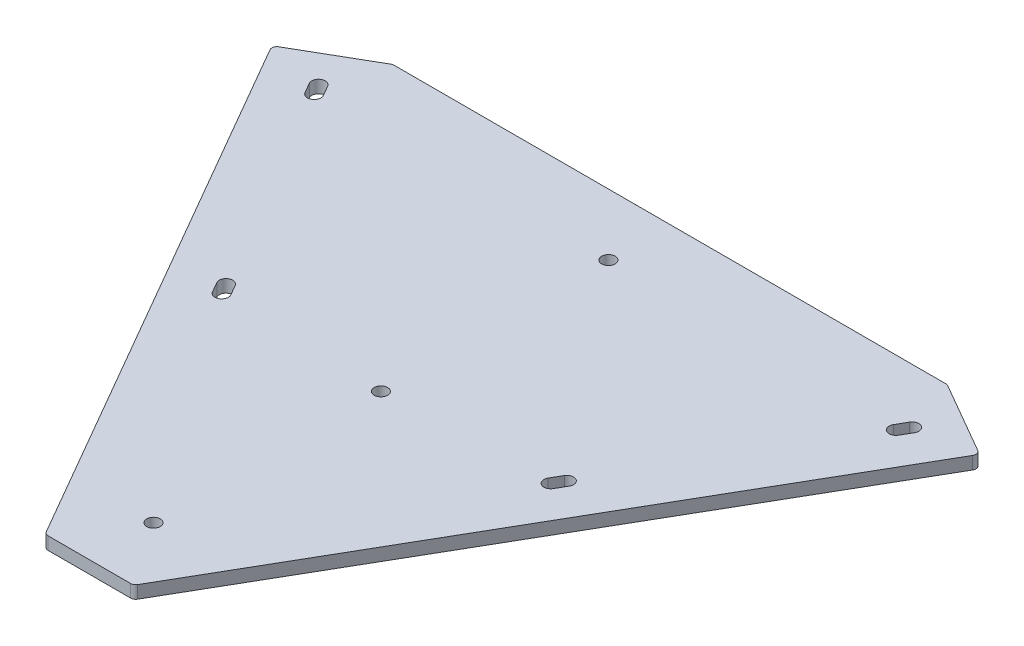
ISO-10303-21;
HEADER;
FILE_DESCRIPTION(('STEP AP214'),'2;1');
FILE_NAME('part.step','',(''),(''),'','','');
FILE_SCHEMA(('AUTOMOTIVE_DESIGN { 1 0 10303 214 1 1 1 1 }'));
ENDSEC;
DATA;
#1=APPLICATION_CONTEXT('core data for automotive mechanical design processes');
#2=APPLICATION_PROTOCOL_DEFINITION('international standard','automotive_design',2000,#1);
#3=PRODUCT_CONTEXT('',#1,'mechanical');
#4=PRODUCT('Part','Part','',(#3));
#5=PRODUCT_RELATED_PRODUCT_CATEGORY('part','',(#4));
#6=PRODUCT_DEFINITION_FORMATION('','',#4);
#7=PRODUCT_DEFINITION_CONTEXT('part definition',#1,'design');
#8=PRODUCT_DEFINITION('design','',#6,#7);
#9=PRODUCT_DEFINITION_SHAPE('','',#8);
#10=(LENGTH_UNIT() NAMED_UNIT(*) SI_UNIT(.MILLI.,.METRE.));
#11=(NAMED_UNIT(*) PLANE_ANGLE_UNIT() SI_UNIT($,.RADIAN.));
#12=(NAMED_UNIT(*) SI_UNIT($,.STERADIAN.) SOLID_ANGLE_UNIT());
#13=UNCERTAINTY_MEASURE_WITH_UNIT(LENGTH_MEASURE(1.E-05),#10,'distance_accuracy_value','');
#14=(GEOMETRIC_REPRESENTATION_CONTEXT(3) GLOBAL_UNCERTAINTY_ASSIGNED_CONTEXT((#13)) GLOBAL_UNIT_ASSIGNED_CONTEXT((#10,
#11,#12)) REPRESENTATION_CONTEXT('',''));
#15=CARTESIAN_POINT('',(0.,0.,0.));
#16=DIRECTION('',(0.,0.,1.));
#17=DIRECTION('',(1.,0.,0.));
#18=AXIS2_PLACEMENT_3D('',#15,#16,#17);
#19=CARTESIAN_POINT('',(0.,6.35,0.));
#20=DIRECTION('',(0.,-1.,0.));
#21=DIRECTION('',(0.,0.,-1.));
#22=AXIS2_PLACEMENT_3D('',#19,#20,#21);
#23=PLANE('',#22);
#24=DIRECTION('',(0.500000000000001,0.,0.866025403784438));
#25=VECTOR('',#24,1.);
#26=CARTESIAN_POINT('',(-152.042092419955,6.35,-301.038228960446));
#27=LINE('',#26,#25);
#28=CARTESIAN_POINT('',(-152.042092419955,6.35,-301.038228960446));
#29=VERTEX_POINT('',#28);
#30=CARTESIAN_POINT('',(-149.070292419956,6.35,-295.890920370512));
#31=VERTEX_POINT('',#30);
#32=EDGE_CURVE('E266',#29,#31,#27,.T.);
#33=ORIENTED_EDGE('',*,*,#32,.F.);
#34=CARTESIAN_POINT('',(-149.116485400892,6.35,-302.727328960445));
#35=DIRECTION('',(0.,1.,0.));
#36=DIRECTION('',(0.,0.,1.));
#37=AXIS2_PLACEMENT_3D('',#34,#35,#36);
#38=CIRCLE('',#37,3.37819999999928);
#39=CARTESIAN_POINT('',(-146.190878381827,6.35,-304.416428960445));
#40=VERTEX_POINT('',#39);
#41=EDGE_CURVE('E231',#40,#29,#38,.T.);
#42=ORIENTED_EDGE('',*,*,#41,.F.);
#43=DIRECTION('',(-0.499999999999997,0.,-0.86602540378444));
#44=VECTOR('',#43,1.);
#45=CARTESIAN_POINT('',(-146.190878381827,6.35,-304.416428960445));
#46=LINE('',#45,#44);
#47=CARTESIAN_POINT('',(-143.219078381827,6.35,-299.269120370512));
#48=VERTEX_POINT('',#47);
#49=EDGE_CURVE('E252',#48,#40,#46,.T.);
#50=ORIENTED_EDGE('',*,*,#49,.F.);
#51=CARTESIAN_POINT('',(-146.144685400892,6.35,-297.580020370512));
#52=DIRECTION('',(0.,1.,0.));
#53=DIRECTION('',(0.,0.,1.));
#54=AXIS2_PLACEMENT_3D('',#51,#52,#53);
#55=CIRCLE('',#54,3.37819999999927);
#56=EDGE_CURVE('E257',#31,#48,#55,.T.);
#57=ORIENTED_EDGE('',*,*,#56,.F.);
#58=EDGE_LOOP('',(#33,#42,#50,#57));
#59=FACE_BOUND('',#58,.T.);
#60=DIRECTION('',(0.499999999999999,0.,-0.866025403784439));
#61=VECTOR('',#60,1.);
#62=CARTESIAN_POINT('',(85.570292419956,6.35,-185.905694089889));
#63=LINE('',#62,#61);
#64=CARTESIAN_POINT('',(85.570292419956,6.35,-185.905694089889));
#65=VERTEX_POINT('',#64);
#66=CARTESIAN_POINT('',(88.542092419956,6.35,-191.053002679822));
#67=VERTEX_POINT('',#66);
#68=EDGE_CURVE('E303',#65,#67,#63,.T.);
#69=ORIENTED_EDGE('',*,*,#68,.F.);
#70=CARTESIAN_POINT('',(82.6446854008914,6.35,-187.594794089889));
#71=DIRECTION('',(0.,1.,0.));
#72=DIRECTION('',(0.,0.,-1.));
#73=AXIS2_PLACEMENT_3D('',#70,#71,#72);
#74=CIRCLE('',#73,3.3782);
#75=CARTESIAN_POINT('',(79.7190783818268,6.35,-189.283894089889));
#76=VERTEX_POINT('',#75);
#77=EDGE_CURVE('E300',#76,#65,#74,.T.);
#78=ORIENTED_EDGE('',*,*,#77,.F.);
#79=DIRECTION('',(-0.500000000000001,0.,0.866025403784438));
#80=VECTOR('',#79,1.);
#81=CARTESIAN_POINT('',(79.7190783818268,6.35,-189.283894089889));
#82=LINE('',#81,#80);
#83=CARTESIAN_POINT('',(82.6908783818268,6.35,-194.431202679822));
#84=VERTEX_POINT('',#83);
#85=EDGE_CURVE('E287',#84,#76,#82,.T.);
#86=ORIENTED_EDGE('',*,*,#85,.F.);
#87=CARTESIAN_POINT('',(85.6164854008914,6.35,-192.742102679822));
#88=DIRECTION('',(0.,1.,0.));
#89=DIRECTION('',(0.,0.,-1.));
#90=AXIS2_PLACEMENT_3D('',#87,#88,#89);
#91=CIRCLE('',#90,3.3782);
#92=EDGE_CURVE('E307',#67,#84,#91,.T.);
#93=ORIENTED_EDGE('',*,*,#92,.F.);
#94=EDGE_LOOP('',(#69,#78,#86,#93));
#95=FACE_BOUND('',#94,.T.);
#96=DIRECTION('',(-0.499999999999997,0.,0.86602540378444));
#97=VECTOR('',#96,1.);
#98=CARTESIAN_POINT('',(146.190878381827,6.35,-304.416428960445));
#99=LINE('',#98,#97);
#100=CARTESIAN_POINT('',(146.190878381827,6.35,-304.416428960445));
#101=VERTEX_POINT('',#100);
#102=CARTESIAN_POINT('',(143.219078381827,6.35,-299.269120370512));
#103=VERTEX_POINT('',#102);
#104=EDGE_CURVE('E391',#101,#103,#99,.T.);
#105=ORIENTED_EDGE('',*,*,#104,.F.);
#106=CARTESIAN_POINT('',(149.116485400892,6.35,-302.727328960445));
#107=DIRECTION('',(0.,1.,0.));
#108=DIRECTION('',(0.,0.,-1.));
#109=AXIS2_PLACEMENT_3D('',#106,#107,#108);
#110=CIRCLE('',#109,3.37819999999928);
#111=CARTESIAN_POINT('',(152.042092419955,6.35,-301.038228960446));
#112=VERTEX_POINT('',#111);
#113=EDGE_CURVE('E317',#112,#101,#110,.T.);
#114=ORIENTED_EDGE('',*,*,#113,.F.);
#115=DIRECTION('',(0.500000000000001,0.,-0.866025403784438));
#116=VECTOR('',#115,1.);
#117=CARTESIAN_POINT('',(152.042092419955,6.35,-301.038228960446));
#118=LINE('',#117,#116);
#119=CARTESIAN_POINT('',(149.070292419956,6.35,-295.890920370512));
#120=VERTEX_POINT('',#119);
#121=EDGE_CURVE('E376',#120,#112,#118,.T.);
#122=ORIENTED_EDGE('',*,*,#121,.F.);
#123=CARTESIAN_POINT('',(146.144685400892,6.35,-297.580020370512));
#124=DIRECTION('',(0.,1.,0.));
#125=DIRECTION('',(0.,0.,-1.));
#126=AXIS2_PLACEMENT_3D('',#123,#124,#125);
#127=CIRCLE('',#126,3.37819999999927);
#128=EDGE_CURVE('E395',#103,#120,#127,.T.);
#129=ORIENTED_EDGE('',*,*,#128,.F.);
#130=EDGE_LOOP('',(#105,#114,#122,#129));
#131=FACE_BOUND('',#130,.T.);
#132=DIRECTION('',(-0.500000000000001,0.,-0.866025403784438));
#133=VECTOR('',#132,1.);
#134=CARTESIAN_POINT('',(-79.7190783818268,6.35,-189.283894089889));
#135=LINE('',#134,#133);
#136=CARTESIAN_POINT('',(-79.7190783818268,6.35,-189.283894089889));
#137=VERTEX_POINT('',#136);
#138=CARTESIAN_POINT('',(-82.6908783818267,6.35,-194.431202679822));
#139=VERTEX_POINT('',#138);
#140=EDGE_CURVE('E348',#137,#139,#135,.T.);
#141=ORIENTED_EDGE('',*,*,#140,.F.);
#142=CARTESIAN_POINT('',(-82.6446854008914,6.35,-187.594794089889));
#143=DIRECTION('',(0.,1.,0.));
#144=DIRECTION('',(0.,0.,1.));
#145=AXIS2_PLACEMENT_3D('',#142,#143,#144);
#146=CIRCLE('',#145,3.3782);
#147=CARTESIAN_POINT('',(-85.570292419956,6.35,-185.905694089889));
#148=VERTEX_POINT('',#147);
#149=EDGE_CURVE('E345',#148,#137,#146,.T.);
#150=ORIENTED_EDGE('',*,*,#149,.F.);
#151=DIRECTION('',(0.499999999999999,0.,0.866025403784439));
#152=VECTOR('',#151,1.);
#153=CARTESIAN_POINT('',(-85.570292419956,6.35,-185.905694089889));
#154=LINE('',#153,#152);
#155=CARTESIAN_POINT('',(-88.542092419956,6.35,-191.053002679822));
#156=VERTEX_POINT('',#155);
#157=EDGE_CURVE('E332',#156,#148,#154,.T.);
#158=ORIENTED_EDGE('',*,*,#157,.F.);
#159=CARTESIAN_POINT('',(-85.6164854008913,6.35,-192.742102679822));
#160=DIRECTION('',(0.,1.,0.));
#161=DIRECTION('',(0.,0.,1.));
#162=AXIS2_PLACEMENT_3D('',#159,#160,#161);
#163=CIRCLE('',#162,3.3782);
#164=EDGE_CURVE('E353',#139,#156,#163,.T.);
#165=ORIENTED_EDGE('',*,*,#164,.F.);
#166=EDGE_LOOP('',(#141,#150,#158,#165));
#167=FACE_BOUND('',#166,.T.);
#168=CARTESIAN_POINT('',(-3.92077460572643E-13,6.35,-184.960881198218));
#169=DIRECTION('',(0.,1.,0.));
#170=DIRECTION('',(0.,0.,1.));
#171=AXIS2_PLACEMENT_3D('',#168,#169,#170);
#172=CIRCLE('',#171,3.37819999999999);
#173=CARTESIAN_POINT('',(-3.92077460572643E-13,6.35,-181.582681198218));
#174=VERTEX_POINT('',#173);
#175=EDGE_CURVE('E420',#174,#174,#172,.T.);
#176=ORIENTED_EDGE('',*,*,#175,.F.);
#177=EDGE_LOOP('',(#176));
#178=FACE_BOUND('',#177,.T.);
#179=CARTESIAN_POINT('',(-7.84154921145286E-13,6.35,-299.260881198218));
#180=DIRECTION('',(0.,1.,0.));
#181=DIRECTION('',(0.,0.,1.));
#182=AXIS2_PLACEMENT_3D('',#179,#180,#181);
#183=CIRCLE('',#182,3.37819999999999);
#184=CARTESIAN_POINT('',(-7.84154921145286E-13,6.35,-295.882681198218));
#185=VERTEX_POINT('',#184);
#186=EDGE_CURVE('E428',#185,#185,#183,.T.);
#187=ORIENTED_EDGE('',*,*,#186,.F.);
#188=EDGE_LOOP('',(#187));
#189=FACE_BOUND('',#188,.T.);
#190=DIRECTION('',(1.,0.,0.));
#191=VECTOR('',#190,1.);
#192=CARTESIAN_POINT('',(-22.225,6.35,-38.4948291982182));
#193=LINE('',#192,#191);
#194=CARTESIAN_POINT('',(-20.7585303162584,6.35,-38.4948291982182));
#195=VERTEX_POINT('',#194);
#196=CARTESIAN_POINT('',(20.7585303162583,6.35,-38.4948291982182));
#197=VERTEX_POINT('',#196);
#198=EDGE_CURVE('E456',#195,#197,#193,.T.);
#199=ORIENTED_EDGE('',*,*,#198,.T.);
#200=CARTESIAN_POINT('',(20.7585303162583,6.35,-41.0348291982182));
#201=DIRECTION('',(0.,-1.,0.));
#202=DIRECTION('',(0.,0.,-1.));
#203=AXIS2_PLACEMENT_3D('',#200,#201,#202);
#204=CIRCLE('',#203,2.54);
#205=CARTESIAN_POINT('',(22.9582348418708,6.35,-39.7648291982182));
#206=VERTEX_POINT('',#205);
#207=EDGE_CURVE('E527',#197,#206,#204,.F.);
#208=ORIENTED_EDGE('',*,*,#207,.T.);
#209=DIRECTION('',(0.500000000000002,0.,-0.866025403784438));
#210=VECTOR('',#209,1.);
#211=CARTESIAN_POINT('',(177.8,6.35,-307.958633585746));
#212=LINE('',#211,#210);
#213=CARTESIAN_POINT('',(176.53,6.35,-305.758929060134));
#214=VERTEX_POINT('',#213);
#215=EDGE_CURVE('E437',#206,#214,#212,.T.);
#216=ORIENTED_EDGE('',*,*,#215,.T.);
#217=CARTESIAN_POINT('',(174.330295474388,6.35,-307.028929060134));
#218=DIRECTION('',(0.,-1.,0.));
#219=DIRECTION('',(0.,0.,-1.));
#220=AXIS2_PLACEMENT_3D('',#217,#218,#219);
#221=CIRCLE('',#220,2.54);
#222=CARTESIAN_POINT('',(175.600295474388,6.35,-309.228633585746));
#223=VERTEX_POINT('',#222);
#224=EDGE_CURVE('E515',#214,#223,#221,.F.);
#225=ORIENTED_EDGE('',*,*,#224,.T.);
#226=DIRECTION('',(-0.866025403784438,0.,-0.500000000000001));
#227=VECTOR('',#226,1.);
#228=CARTESIAN_POINT('',(177.8,6.35,-307.958633585746));
#229=LINE('',#228,#227);
#230=CARTESIAN_POINT('',(139.894579853007,6.35,-329.843338111359));
#231=VERTEX_POINT('',#230);
#232=EDGE_CURVE('E441',#223,#231,#229,.T.);
#233=ORIENTED_EDGE('',*,*,#232,.T.);
#234=CARTESIAN_POINT('',(138.624579853007,6.35,-327.643633585746));
#235=DIRECTION('',(0.,-1.,0.));
#236=DIRECTION('',(0.,0.,-1.));
#237=AXIS2_PLACEMENT_3D('',#234,#235,#236);
#238=CIRCLE('',#237,2.54);
#239=CARTESIAN_POINT('',(138.624579853007,6.35,-330.183633585746));
#240=VERTEX_POINT('',#239);
#241=EDGE_CURVE('E518',#231,#240,#238,.F.);
#242=ORIENTED_EDGE('',*,*,#241,.T.);
#243=DIRECTION('',(-1.,0.,0.));
#244=VECTOR('',#243,1.);
#245=CARTESIAN_POINT('',(-139.305170801782,6.35,-330.183633585746));
#246=LINE('',#245,#244);
#247=CARTESIAN_POINT('',(-138.624579853007,6.35,-330.183633585746));
#248=VERTEX_POINT('',#247);
#249=EDGE_CURVE('E446',#240,#248,#246,.T.);
#250=ORIENTED_EDGE('',*,*,#249,.T.);
#251=CARTESIAN_POINT('',(-138.624579853007,6.35,-327.643633585746));
#252=DIRECTION('',(0.,-1.,0.));
#253=DIRECTION('',(0.,0.,-1.));
#254=AXIS2_PLACEMENT_3D('',#251,#252,#253);
#255=CIRCLE('',#254,2.54);
#256=CARTESIAN_POINT('',(-139.894579853007,6.35,-329.843338111359));
#257=VERTEX_POINT('',#256);
#258=EDGE_CURVE('E521',#248,#257,#255,.F.);
#259=ORIENTED_EDGE('',*,*,#258,.T.);
#260=DIRECTION('',(-0.866025403784438,0.,0.500000000000001));
#261=VECTOR('',#260,1.);
#262=CARTESIAN_POINT('',(-177.8,6.35,-307.958633585746));
#263=LINE('',#262,#261);
#264=CARTESIAN_POINT('',(-175.600295474388,6.35,-309.228633585746));
#265=VERTEX_POINT('',#264);
#266=EDGE_CURVE('E450',#257,#265,#263,.T.);
#267=ORIENTED_EDGE('',*,*,#266,.T.);
#268=CARTESIAN_POINT('',(-174.330295474388,6.35,-307.028929060134));
#269=DIRECTION('',(0.,-1.,0.));
#270=DIRECTION('',(0.,0.,-1.));
#271=AXIS2_PLACEMENT_3D('',#268,#269,#270);
#272=CIRCLE('',#271,2.54);
#273=CARTESIAN_POINT('',(-176.53,6.35,-305.758929060134));
#274=VERTEX_POINT('',#273);
#275=EDGE_CURVE('E60',#265,#274,#272,.F.);
#276=ORIENTED_EDGE('',*,*,#275,.T.);
#277=DIRECTION('',(0.500000000000002,0.,0.866025403784438));
#278=VECTOR('',#277,1.);
#279=CARTESIAN_POINT('',(-177.8,6.35,-307.958633585746));
#280=LINE('',#279,#278);
#281=CARTESIAN_POINT('',(-22.9582348418708,6.35,-39.7648291982181));
#282=VERTEX_POINT('',#281);
#283=EDGE_CURVE('E453',#274,#282,#280,.T.);
#284=ORIENTED_EDGE('',*,*,#283,.T.);
#285=CARTESIAN_POINT('',(-20.7585303162584,6.35,-41.0348291982182));
#286=DIRECTION('',(0.,-1.,0.));
#287=DIRECTION('',(0.,0.,-1.));
#288=AXIS2_PLACEMENT_3D('',#285,#286,#287);
#289=CIRCLE('',#288,2.54);
#290=EDGE_CURVE('E524',#282,#195,#289,.F.);
#291=ORIENTED_EDGE('',*,*,#290,.T.);
#292=EDGE_LOOP('',(#199,#208,#216,#225,#233,#242,#250,#259,#267,#276,#284,#291));
#293=FACE_BOUND('',#292,.T.);
#294=CARTESIAN_POINT('',(0.,6.35,-70.6608811982182));
#295=DIRECTION('',(0.,1.,0.));
#296=DIRECTION('',(0.,0.,1.));
#297=AXIS2_PLACEMENT_3D('',#294,#295,#296);
#298=CIRCLE('',#297,3.37819999999999);
#299=CARTESIAN_POINT('',(0.,6.35,-67.2826811982182));
#300=VERTEX_POINT('',#299);
#301=EDGE_CURVE('E276',#300,#300,#298,.T.);
#302=ORIENTED_EDGE('',*,*,#301,.F.);
#303=EDGE_LOOP('',(#302));
#304=FACE_BOUND('',#303,.T.);
#305=ADVANCED_FACE('F37',(#59,#95,#131,#167,#178,#189,#293,#304),#23,.F.);
#306=CARTESIAN_POINT('',(177.8,6.35,-307.958633585746));
#307=DIRECTION('',(-0.866025403784438,0.,-0.500000000000002));
#308=DIRECTION('',(-0.500000000000002,0.,0.866025403784438));
#309=AXIS2_PLACEMENT_3D('',#306,#307,#308);
#310=PLANE('',#309);
#311=ORIENTED_EDGE('',*,*,#215,.F.);
#312=DIRECTION('',(0.,-1.,0.));
#313=VECTOR('',#312,1.);
#314=CARTESIAN_POINT('',(22.9582348418708,6.35,-39.7648291982182));
#315=LINE('',#314,#313);
#316=CARTESIAN_POINT('',(22.9582348418708,0.,-39.7648291982182));
#317=VERTEX_POINT('',#316);
#318=EDGE_CURVE('E484',#206,#317,#315,.T.);
#319=ORIENTED_EDGE('',*,*,#318,.T.);
#320=DIRECTION('',(0.500000000000002,0.,-0.866025403784438));
#321=VECTOR('',#320,1.);
#322=CARTESIAN_POINT('',(177.8,0.,-307.958633585746));
#323=LINE('',#322,#321);
#324=CARTESIAN_POINT('',(176.53,0.,-305.758929060134));
#325=VERTEX_POINT('',#324);
#326=EDGE_CURVE('E436',#317,#325,#323,.T.);
#327=ORIENTED_EDGE('',*,*,#326,.T.);
#328=DIRECTION('',(0.,-1.,0.));
#329=VECTOR('',#328,1.);
#330=CARTESIAN_POINT('',(176.53,6.35,-305.758929060134));
#331=LINE('',#330,#329);
#332=EDGE_CURVE('E460',#325,#214,#331,.F.);
#333=ORIENTED_EDGE('',*,*,#332,.T.);
#334=EDGE_LOOP('',(#311,#319,#327,#333));
#335=FACE_BOUND('',#334,.T.);
#336=ADVANCED_FACE('F600',(#335),#310,.F.);
#337=CARTESIAN_POINT('',(177.8,6.35,-307.958633585746));
#338=DIRECTION('',(-0.500000000000001,0.,0.866025403784438));
#339=DIRECTION('',(0.866025403784438,0.,0.500000000000001));
#340=AXIS2_PLACEMENT_3D('',#337,#338,#339);
#341=PLANE('',#340);
#342=DIRECTION('',(-0.866025403784438,0.,-0.500000000000001));
#343=VECTOR('',#342,1.);
#344=CARTESIAN_POINT('',(177.8,0.,-307.958633585746));
#345=LINE('',#344,#343);
#346=CARTESIAN_POINT('',(175.600295474388,0.,-309.228633585746));
#347=VERTEX_POINT('',#346);
#348=CARTESIAN_POINT('',(139.894579853007,0.,-329.843338111359));
#349=VERTEX_POINT('',#348);
#350=EDGE_CURVE('E464',#347,#349,#345,.T.);
#351=ORIENTED_EDGE('',*,*,#350,.T.);
#352=DIRECTION('',(0.,-1.,0.));
#353=VECTOR('',#352,1.);
#354=CARTESIAN_POINT('',(139.894579853007,6.35,-329.843338111359));
#355=LINE('',#354,#353);
#356=EDGE_CURVE('E11',#349,#231,#355,.F.);
#357=ORIENTED_EDGE('',*,*,#356,.T.);
#358=ORIENTED_EDGE('',*,*,#232,.F.);
#359=DIRECTION('',(0.,-1.,0.));
#360=VECTOR('',#359,1.);
#361=CARTESIAN_POINT('',(175.600295474388,6.35,-309.228633585746));
#362=LINE('',#361,#360);
#363=EDGE_CURVE('E46',#223,#347,#362,.T.);
#364=ORIENTED_EDGE('',*,*,#363,.T.);
#365=EDGE_LOOP('',(#351,#357,#358,#364));
#366=FACE_BOUND('',#365,.T.);
#367=ADVANCED_FACE('F556',(#366),#341,.F.);
#368=CARTESIAN_POINT('',(-139.305170801782,6.35,-330.183633585746));
#369=DIRECTION('',(0.,0.,1.));
#370=DIRECTION('',(1.,0.,0.));
#371=AXIS2_PLACEMENT_3D('',#368,#369,#370);
#372=PLANE('',#371);
#373=DIRECTION('',(-1.,0.,0.));
#374=VECTOR('',#373,1.);
#375=CARTESIAN_POINT('',(-139.305170801782,0.,-330.183633585746));
#376=LINE('',#375,#374);
#377=CARTESIAN_POINT('',(138.624579853007,0.,-330.183633585746));
#378=VERTEX_POINT('',#377);
#379=CARTESIAN_POINT('',(-138.624579853007,0.,-330.183633585746));
#380=VERTEX_POINT('',#379);
#381=EDGE_CURVE('E468',#378,#380,#376,.T.);
#382=ORIENTED_EDGE('',*,*,#381,.T.);
#383=DIRECTION('',(0.,-1.,0.));
#384=VECTOR('',#383,1.);
#385=CARTESIAN_POINT('',(-138.624579853007,6.35,-330.183633585746));
#386=LINE('',#385,#384);
#387=EDGE_CURVE('E547',#380,#248,#386,.F.);
#388=ORIENTED_EDGE('',*,*,#387,.T.);
#389=ORIENTED_EDGE('',*,*,#249,.F.);
#390=DIRECTION('',(0.,-1.,0.));
#391=VECTOR('',#390,1.);
#392=CARTESIAN_POINT('',(138.624579853007,6.35,-330.183633585746));
#393=LINE('',#392,#391);
#394=EDGE_CURVE('E543',#240,#378,#393,.T.);
#395=ORIENTED_EDGE('',*,*,#394,.T.);
#396=EDGE_LOOP('',(#382,#388,#389,#395));
#397=FACE_BOUND('',#396,.T.);
#398=ADVANCED_FACE('F569',(#397),#372,.F.);
#399=CARTESIAN_POINT('',(-177.8,6.35,-307.958633585746));
#400=DIRECTION('',(0.500000000000001,0.,0.866025403784438));
#401=DIRECTION('',(0.866025403784438,0.,-0.500000000000001));
#402=AXIS2_PLACEMENT_3D('',#399,#400,#401);
#403=PLANE('',#402);
#404=ORIENTED_EDGE('',*,*,#266,.F.);
#405=DIRECTION('',(0.,-1.,0.));
#406=VECTOR('',#405,1.);
#407=CARTESIAN_POINT('',(-139.894579853007,6.35,-329.843338111359));
#408=LINE('',#407,#406);
#409=CARTESIAN_POINT('',(-139.894579853007,0.,-329.843338111359));
#410=VERTEX_POINT('',#409);
#411=EDGE_CURVE('E539',#257,#410,#408,.T.);
#412=ORIENTED_EDGE('',*,*,#411,.T.);
#413=DIRECTION('',(-0.866025403784438,0.,0.500000000000001));
#414=VECTOR('',#413,1.);
#415=CARTESIAN_POINT('',(-177.8,0.,-307.958633585746));
#416=LINE('',#415,#414);
#417=CARTESIAN_POINT('',(-175.600295474388,0.,-309.228633585746));
#418=VERTEX_POINT('',#417);
#419=EDGE_CURVE('E472',#410,#418,#416,.T.);
#420=ORIENTED_EDGE('',*,*,#419,.T.);
#421=DIRECTION('',(0.,-1.,0.));
#422=VECTOR('',#421,1.);
#423=CARTESIAN_POINT('',(-175.600295474388,6.35,-309.228633585746));
#424=LINE('',#423,#422);
#425=EDGE_CURVE('E536',#418,#265,#424,.F.);
#426=ORIENTED_EDGE('',*,*,#425,.T.);
#427=EDGE_LOOP('',(#404,#412,#420,#426));
#428=FACE_BOUND('',#427,.T.);
#429=ADVANCED_FACE('F579',(#428),#403,.F.);
#430=CARTESIAN_POINT('',(-177.8,6.35,-307.958633585746));
#431=DIRECTION('',(0.866025403784438,0.,-0.500000000000001));
#432=DIRECTION('',(-0.500000000000002,0.,-0.866025403784438));
#433=AXIS2_PLACEMENT_3D('',#430,#431,#432);
#434=PLANE('',#433);
#435=DIRECTION('',(0.500000000000002,0.,0.866025403784438));
#436=VECTOR('',#435,1.);
#437=CARTESIAN_POINT('',(-177.8,0.,-307.958633585746));
#438=LINE('',#437,#436);
#439=CARTESIAN_POINT('',(-176.53,0.,-305.758929060134));
#440=VERTEX_POINT('',#439);
#441=CARTESIAN_POINT('',(-22.9582348418708,0.,-39.7648291982181));
#442=VERTEX_POINT('',#441);
#443=EDGE_CURVE('E476',#440,#442,#438,.T.);
#444=ORIENTED_EDGE('',*,*,#443,.T.);
#445=DIRECTION('',(0.,-1.,0.));
#446=VECTOR('',#445,1.);
#447=CARTESIAN_POINT('',(-22.9582348418708,6.35,-39.7648291982182));
#448=LINE('',#447,#446);
#449=EDGE_CURVE('E53',#442,#282,#448,.F.);
#450=ORIENTED_EDGE('',*,*,#449,.T.);
#451=ORIENTED_EDGE('',*,*,#283,.F.);
#452=DIRECTION('',(0.,-1.,0.));
#453=VECTOR('',#452,1.);
#454=CARTESIAN_POINT('',(-176.53,6.35,-305.758929060134));
#455=LINE('',#454,#453);
#456=EDGE_CURVE('E530',#274,#440,#455,.T.);
#457=ORIENTED_EDGE('',*,*,#456,.T.);
#458=EDGE_LOOP('',(#444,#450,#451,#457));
#459=FACE_BOUND('',#458,.T.);
#460=ADVANCED_FACE('F584',(#459),#434,.F.);
#461=CARTESIAN_POINT('',(-22.225,6.35,-38.4948291982182));
#462=DIRECTION('',(0.,0.,-1.));
#463=DIRECTION('',(-1.,0.,0.));
#464=AXIS2_PLACEMENT_3D('',#461,#462,#463);
#465=PLANE('',#464);
#466=DIRECTION('',(1.,0.,0.));
#467=VECTOR('',#466,1.);
#468=CARTESIAN_POINT('',(-22.225,0.,-38.4948291982182));
#469=LINE('',#468,#467);
#470=CARTESIAN_POINT('',(-20.7585303162584,0.,-38.4948291982182));
#471=VERTEX_POINT('',#470);
#472=CARTESIAN_POINT('',(20.7585303162583,0.,-38.4948291982182));
#473=VERTEX_POINT('',#472);
#474=EDGE_CURVE('E442',#471,#473,#469,.T.);
#475=ORIENTED_EDGE('',*,*,#474,.T.);
#476=DIRECTION('',(0.,-1.,0.));
#477=VECTOR('',#476,1.);
#478=CARTESIAN_POINT('',(20.7585303162583,6.35,-38.4948291982182));
#479=LINE('',#478,#477);
#480=EDGE_CURVE('E510',#473,#197,#479,.F.);
#481=ORIENTED_EDGE('',*,*,#480,.T.);
#482=ORIENTED_EDGE('',*,*,#198,.F.);
#483=DIRECTION('',(0.,-1.,0.));
#484=VECTOR('',#483,1.);
#485=CARTESIAN_POINT('',(-20.7585303162584,6.35,-38.4948291982182));
#486=LINE('',#485,#484);
#487=EDGE_CURVE('E506',#195,#471,#486,.T.);
#488=ORIENTED_EDGE('',*,*,#487,.T.);
#489=EDGE_LOOP('',(#475,#481,#482,#488));
#490=FACE_BOUND('',#489,.T.);
#491=ADVANCED_FACE('F592',(#490),#465,.F.);
#492=CARTESIAN_POINT('',(0.,0.,0.));
#493=DIRECTION('',(0.,-1.,0.));
#494=DIRECTION('',(0.,0.,-1.));
#495=AXIS2_PLACEMENT_3D('',#492,#493,#494);
#496=PLANE('',#495);
#497=CARTESIAN_POINT('',(-149.116485400892,0.,-302.727328960445));
#498=DIRECTION('',(0.,1.,0.));
#499=DIRECTION('',(0.,0.,1.));
#500=AXIS2_PLACEMENT_3D('',#497,#498,#499);
#501=CIRCLE('',#500,3.37819999999928);
#502=CARTESIAN_POINT('',(-146.190878381827,0.,-304.416428960445));
#503=VERTEX_POINT('',#502);
#504=CARTESIAN_POINT('',(-152.042092419955,0.,-301.038228960446));
#505=VERTEX_POINT('',#504);
#506=EDGE_CURVE('E228',#503,#505,#501,.T.);
#507=ORIENTED_EDGE('',*,*,#506,.T.);
#508=DIRECTION('',(0.500000000000001,0.,0.866025403784438));
#509=VECTOR('',#508,1.);
#510=CARTESIAN_POINT('',(-152.042092419955,0.,-301.038228960446));
#511=LINE('',#510,#509);
#512=CARTESIAN_POINT('',(-149.070292419955,0.,-295.890920370512));
#513=VERTEX_POINT('',#512);
#514=EDGE_CURVE('E241',#505,#513,#511,.T.);
#515=ORIENTED_EDGE('',*,*,#514,.T.);
#516=CARTESIAN_POINT('',(-146.144685400892,0.,-297.580020370512));
#517=DIRECTION('',(0.,1.,0.));
#518=DIRECTION('',(0.,0.,1.));
#519=AXIS2_PLACEMENT_3D('',#516,#517,#518);
#520=CIRCLE('',#519,3.37819999999927);
#521=CARTESIAN_POINT('',(-143.219078381827,0.,-299.269120370512));
#522=VERTEX_POINT('',#521);
#523=EDGE_CURVE('E246',#513,#522,#520,.T.);
#524=ORIENTED_EDGE('',*,*,#523,.T.);
#525=DIRECTION('',(-0.499999999999997,0.,-0.86602540378444));
#526=VECTOR('',#525,1.);
#527=CARTESIAN_POINT('',(-146.190878381827,0.,-304.416428960445));
#528=LINE('',#527,#526);
#529=EDGE_CURVE('E237',#522,#503,#528,.T.);
#530=ORIENTED_EDGE('',*,*,#529,.T.);
#531=EDGE_LOOP('',(#507,#515,#524,#530));
#532=FACE_BOUND('',#531,.T.);
#533=CARTESIAN_POINT('',(82.6446854008914,0.,-187.594794089889));
#534=DIRECTION('',(0.,1.,0.));
#535=DIRECTION('',(0.,0.,-1.));
#536=AXIS2_PLACEMENT_3D('',#533,#534,#535);
#537=CIRCLE('',#536,3.3782);
#538=CARTESIAN_POINT('',(79.7190783818268,0.,-189.283894089889));
#539=VERTEX_POINT('',#538);
#540=CARTESIAN_POINT('',(85.570292419956,0.,-185.905694089889));
#541=VERTEX_POINT('',#540);
#542=EDGE_CURVE('E282',#539,#541,#537,.T.);
#543=ORIENTED_EDGE('',*,*,#542,.T.);
#544=DIRECTION('',(0.499999999999999,0.,-0.866025403784439));
#545=VECTOR('',#544,1.);
#546=CARTESIAN_POINT('',(85.570292419956,0.,-185.905694089889));
#547=LINE('',#546,#545);
#548=CARTESIAN_POINT('',(88.542092419956,0.,-191.053002679822));
#549=VERTEX_POINT('',#548);
#550=EDGE_CURVE('E286',#541,#549,#547,.T.);
#551=ORIENTED_EDGE('',*,*,#550,.T.);
#552=CARTESIAN_POINT('',(85.6164854008914,0.,-192.742102679822));
#553=DIRECTION('',(0.,1.,0.));
#554=DIRECTION('',(0.,0.,-1.));
#555=AXIS2_PLACEMENT_3D('',#552,#553,#554);
#556=CIRCLE('',#555,3.3782);
#557=CARTESIAN_POINT('',(82.6908783818268,0.,-194.431202679822));
#558=VERTEX_POINT('',#557);
#559=EDGE_CURVE('E291',#549,#558,#556,.T.);
#560=ORIENTED_EDGE('',*,*,#559,.T.);
#561=DIRECTION('',(-0.500000000000001,0.,0.866025403784438));
#562=VECTOR('',#561,1.);
#563=CARTESIAN_POINT('',(79.7190783818268,0.,-189.283894089889));
#564=LINE('',#563,#562);
#565=EDGE_CURVE('E295',#558,#539,#564,.T.);
#566=ORIENTED_EDGE('',*,*,#565,.T.);
#567=EDGE_LOOP('',(#543,#551,#560,#566));
#568=FACE_BOUND('',#567,.T.);
#569=CARTESIAN_POINT('',(149.116485400892,0.,-302.727328960445));
#570=DIRECTION('',(0.,1.,0.));
#571=DIRECTION('',(0.,0.,-1.));
#572=AXIS2_PLACEMENT_3D('',#569,#570,#571);
#573=CIRCLE('',#572,3.37819999999928);
#574=CARTESIAN_POINT('',(152.042092419955,0.,-301.038228960446));
#575=VERTEX_POINT('',#574);
#576=CARTESIAN_POINT('',(146.190878381827,0.,-304.416428960445));
#577=VERTEX_POINT('',#576);
#578=EDGE_CURVE('E371',#575,#577,#573,.T.);
#579=ORIENTED_EDGE('',*,*,#578,.T.);
#580=DIRECTION('',(-0.499999999999997,0.,0.86602540378444));
#581=VECTOR('',#580,1.);
#582=CARTESIAN_POINT('',(146.190878381827,0.,-304.416428960445));
#583=LINE('',#582,#581);
#584=CARTESIAN_POINT('',(143.219078381827,0.,-299.269120370512));
#585=VERTEX_POINT('',#584);
#586=EDGE_CURVE('E375',#577,#585,#583,.T.);
#587=ORIENTED_EDGE('',*,*,#586,.T.);
#588=CARTESIAN_POINT('',(146.144685400892,0.,-297.580020370512));
#589=DIRECTION('',(0.,1.,0.));
#590=DIRECTION('',(0.,0.,-1.));
#591=AXIS2_PLACEMENT_3D('',#588,#589,#590);
#592=CIRCLE('',#591,3.37819999999927);
#593=CARTESIAN_POINT('',(149.070292419956,0.,-295.890920370512));
#594=VERTEX_POINT('',#593);
#595=EDGE_CURVE('E380',#585,#594,#592,.T.);
#596=ORIENTED_EDGE('',*,*,#595,.T.);
#597=DIRECTION('',(0.500000000000001,0.,-0.866025403784438));
#598=VECTOR('',#597,1.);
#599=CARTESIAN_POINT('',(152.042092419955,0.,-301.038228960446));
#600=LINE('',#599,#598);
#601=EDGE_CURVE('E384',#594,#575,#600,.T.);
#602=ORIENTED_EDGE('',*,*,#601,.T.);
#603=EDGE_LOOP('',(#579,#587,#596,#602));
#604=FACE_BOUND('',#603,.T.);
#605=CARTESIAN_POINT('',(-82.6446854008914,0.,-187.594794089889));
#606=DIRECTION('',(0.,1.,0.));
#607=DIRECTION('',(0.,0.,1.));
#608=AXIS2_PLACEMENT_3D('',#605,#606,#607);
#609=CIRCLE('',#608,3.3782);
#610=CARTESIAN_POINT('',(-85.570292419956,0.,-185.905694089889));
#611=VERTEX_POINT('',#610);
#612=CARTESIAN_POINT('',(-79.7190783818268,0.,-189.283894089889));
#613=VERTEX_POINT('',#612);
#614=EDGE_CURVE('E327',#611,#613,#609,.T.);
#615=ORIENTED_EDGE('',*,*,#614,.T.);
#616=DIRECTION('',(-0.500000000000001,0.,-0.866025403784438));
#617=VECTOR('',#616,1.);
#618=CARTESIAN_POINT('',(-79.7190783818268,0.,-189.283894089889));
#619=LINE('',#618,#617);
#620=CARTESIAN_POINT('',(-82.6908783818268,0.,-194.431202679822));
#621=VERTEX_POINT('',#620);
#622=EDGE_CURVE('E331',#613,#621,#619,.T.);
#623=ORIENTED_EDGE('',*,*,#622,.T.);
#624=CARTESIAN_POINT('',(-85.6164854008913,0.,-192.742102679822));
#625=DIRECTION('',(0.,1.,0.));
#626=DIRECTION('',(0.,0.,1.));
#627=AXIS2_PLACEMENT_3D('',#624,#625,#626);
#628=CIRCLE('',#627,3.3782);
#629=CARTESIAN_POINT('',(-88.542092419956,0.,-191.053002679822));
#630=VERTEX_POINT('',#629);
#631=EDGE_CURVE('E336',#621,#630,#628,.T.);
#632=ORIENTED_EDGE('',*,*,#631,.T.);
#633=DIRECTION('',(0.499999999999999,0.,0.866025403784439));
#634=VECTOR('',#633,1.);
#635=CARTESIAN_POINT('',(-85.570292419956,0.,-185.905694089889));
#636=LINE('',#635,#634);
#637=EDGE_CURVE('E340',#630,#611,#636,.T.);
#638=ORIENTED_EDGE('',*,*,#637,.T.);
#639=EDGE_LOOP('',(#615,#623,#632,#638));
#640=FACE_BOUND('',#639,.T.);
#641=CARTESIAN_POINT('',(0.,0.,-70.6608811982182));
#642=DIRECTION('',(0.,1.,0.));
#643=DIRECTION('',(0.,0.,1.));
#644=AXIS2_PLACEMENT_3D('',#641,#642,#643);
#645=CIRCLE('',#644,3.3782);
#646=CARTESIAN_POINT('',(0.,0.,-67.2826811982182));
#647=VERTEX_POINT('',#646);
#648=EDGE_CURVE('E416',#647,#647,#645,.T.);
#649=ORIENTED_EDGE('',*,*,#648,.T.);
#650=EDGE_LOOP('',(#649));
#651=FACE_BOUND('',#650,.T.);
#652=CARTESIAN_POINT('',(-3.92077460572643E-13,0.,-184.960881198218));
#653=DIRECTION('',(0.,1.,0.));
#654=DIRECTION('',(0.,0.,1.));
#655=AXIS2_PLACEMENT_3D('',#652,#653,#654);
#656=CIRCLE('',#655,3.3782);
#657=CARTESIAN_POINT('',(-3.92077460572643E-13,0.,-181.582681198218));
#658=VERTEX_POINT('',#657);
#659=EDGE_CURVE('E424',#658,#658,#656,.T.);
#660=ORIENTED_EDGE('',*,*,#659,.T.);
#661=EDGE_LOOP('',(#660));
#662=FACE_BOUND('',#661,.T.);
#663=CARTESIAN_POINT('',(-7.84154921145286E-13,0.,-299.260881198218));
#664=DIRECTION('',(0.,1.,0.));
#665=DIRECTION('',(0.,0.,1.));
#666=AXIS2_PLACEMENT_3D('',#663,#664,#665);
#667=CIRCLE('',#666,3.3782);
#668=CARTESIAN_POINT('',(-7.84154921145286E-13,0.,-295.882681198218));
#669=VERTEX_POINT('',#668);
#670=EDGE_CURVE('E432',#669,#669,#667,.T.);
#671=ORIENTED_EDGE('',*,*,#670,.T.);
#672=EDGE_LOOP('',(#671));
#673=FACE_BOUND('',#672,.T.);
#674=ORIENTED_EDGE('',*,*,#326,.F.);
#675=CARTESIAN_POINT('',(20.7585303162583,0.,-41.0348291982182));
#676=DIRECTION('',(0.,-1.,0.));
#677=DIRECTION('',(0.,0.,-1.));
#678=AXIS2_PLACEMENT_3D('',#675,#676,#677);
#679=CIRCLE('',#678,2.54);
#680=EDGE_CURVE('E503',#317,#473,#679,.T.);
#681=ORIENTED_EDGE('',*,*,#680,.T.);
#682=ORIENTED_EDGE('',*,*,#474,.F.);
#683=CARTESIAN_POINT('',(-20.7585303162584,0.,-41.0348291982182));
#684=DIRECTION('',(0.,-1.,0.));
#685=DIRECTION('',(0.,0.,-1.));
#686=AXIS2_PLACEMENT_3D('',#683,#684,#685);
#687=CIRCLE('',#686,2.54);
#688=EDGE_CURVE('E500',#471,#442,#687,.T.);
#689=ORIENTED_EDGE('',*,*,#688,.T.);
#690=ORIENTED_EDGE('',*,*,#443,.F.);
#691=CARTESIAN_POINT('',(-174.330295474388,0.,-307.028929060134));
#692=DIRECTION('',(0.,-1.,0.));
#693=DIRECTION('',(0.,0.,-1.));
#694=AXIS2_PLACEMENT_3D('',#691,#692,#693);
#695=CIRCLE('',#694,2.54);
#696=EDGE_CURVE('E488',#440,#418,#695,.T.);
#697=ORIENTED_EDGE('',*,*,#696,.T.);
#698=ORIENTED_EDGE('',*,*,#419,.F.);
#699=CARTESIAN_POINT('',(-138.624579853007,0.,-327.643633585746));
#700=DIRECTION('',(0.,-1.,0.));
#701=DIRECTION('',(0.,0.,-1.));
#702=AXIS2_PLACEMENT_3D('',#699,#700,#701);
#703=CIRCLE('',#702,2.54);
#704=EDGE_CURVE('E497',#410,#380,#703,.T.);
#705=ORIENTED_EDGE('',*,*,#704,.T.);
#706=ORIENTED_EDGE('',*,*,#381,.F.);
#707=CARTESIAN_POINT('',(138.624579853007,0.,-327.643633585746));
#708=DIRECTION('',(0.,-1.,0.));
#709=DIRECTION('',(0.,0.,-1.));
#710=AXIS2_PLACEMENT_3D('',#707,#708,#709);
#711=CIRCLE('',#710,2.54);
#712=EDGE_CURVE('E494',#378,#349,#711,.T.);
#713=ORIENTED_EDGE('',*,*,#712,.T.);
#714=ORIENTED_EDGE('',*,*,#350,.F.);
#715=CARTESIAN_POINT('',(174.330295474388,0.,-307.028929060134));
#716=DIRECTION('',(0.,-1.,0.));
#717=DIRECTION('',(0.,0.,-1.));
#718=AXIS2_PLACEMENT_3D('',#715,#716,#717);
#719=CIRCLE('',#718,2.54);
#720=EDGE_CURVE('E491',#347,#325,#719,.T.);
#721=ORIENTED_EDGE('',*,*,#720,.T.);
#722=EDGE_LOOP('',(#674,#681,#682,#689,#690,#697,#698,#705,#706,#713,#714,#721));
#723=FACE_BOUND('',#722,.T.);
#724=ADVANCED_FACE('F248',(#532,#568,#604,#640,#651,#662,#673,#723),#496,.T.);
#725=CARTESIAN_POINT('',(-7.84154921145286E-13,6.35,-299.260881198218));
#726=DIRECTION('',(0.,1.,0.));
#727=DIRECTION('',(0.,0.,1.));
#728=AXIS2_PLACEMENT_3D('',#725,#726,#727);
#729=CYLINDRICAL_SURFACE('',#728,3.37819999999999);
#730=ORIENTED_EDGE('',*,*,#670,.F.);
#731=EDGE_LOOP('',(#730));
#732=FACE_BOUND('',#731,.T.);
#733=ORIENTED_EDGE('',*,*,#186,.T.);
#734=EDGE_LOOP('',(#733));
#735=FACE_BOUND('',#734,.T.);
#736=ADVANCED_FACE('F619',(#732,#735),#729,.F.);
#737=CARTESIAN_POINT('',(-3.92077460572643E-13,6.35,-184.960881198218));
#738=DIRECTION('',(0.,1.,0.));
#739=DIRECTION('',(0.,0.,1.));
#740=AXIS2_PLACEMENT_3D('',#737,#738,#739);
#741=CYLINDRICAL_SURFACE('',#740,3.37819999999999);
#742=ORIENTED_EDGE('',*,*,#659,.F.);
#743=EDGE_LOOP('',(#742));
#744=FACE_BOUND('',#743,.T.);
#745=ORIENTED_EDGE('',*,*,#175,.T.);
#746=EDGE_LOOP('',(#745));
#747=FACE_BOUND('',#746,.T.);
#748=ADVANCED_FACE('F846',(#744,#747),#741,.F.);
#749=CARTESIAN_POINT('',(0.,6.35,-70.6608811982182));
#750=DIRECTION('',(0.,1.,0.));
#751=DIRECTION('',(0.,0.,1.));
#752=AXIS2_PLACEMENT_3D('',#749,#750,#751);
#753=CYLINDRICAL_SURFACE('',#752,3.37819999999999);
#754=ORIENTED_EDGE('',*,*,#648,.F.);
#755=EDGE_LOOP('',(#754));
#756=FACE_BOUND('',#755,.T.);
#757=ORIENTED_EDGE('',*,*,#301,.T.);
#758=EDGE_LOOP('',(#757));
#759=FACE_BOUND('',#758,.T.);
#760=ADVANCED_FACE('F836',(#756,#759),#753,.F.);
#761=CARTESIAN_POINT('',(-82.6446854008914,0.,-187.594794089889));
#762=DIRECTION('',(0.,1.,0.));
#763=DIRECTION('',(0.,0.,1.));
#764=AXIS2_PLACEMENT_3D('',#761,#762,#763);
#765=CYLINDRICAL_SURFACE('',#764,3.3782);
#766=ORIENTED_EDGE('',*,*,#149,.T.);
#767=DIRECTION('',(0.,1.,0.));
#768=VECTOR('',#767,1.);
#769=CARTESIAN_POINT('',(-79.7190783818268,0.,-189.283894089889));
#770=LINE('',#769,#768);
#771=EDGE_CURVE('E344',#613,#137,#770,.T.);
#772=ORIENTED_EDGE('',*,*,#771,.F.);
#773=ORIENTED_EDGE('',*,*,#614,.F.);
#774=DIRECTION('',(0.,1.,0.));
#775=VECTOR('',#774,1.);
#776=CARTESIAN_POINT('',(-85.570292419956,0.,-185.905694089889));
#777=LINE('',#776,#775);
#778=EDGE_CURVE('E267',#611,#148,#777,.T.);
#779=ORIENTED_EDGE('',*,*,#778,.T.);
#780=EDGE_LOOP('',(#766,#772,#773,#779));
#781=FACE_BOUND('',#780,.T.);
#782=ADVANCED_FACE('F826',(#781),#765,.F.);
#783=CARTESIAN_POINT('',(-85.570292419956,0.,-185.905694089889));
#784=DIRECTION('',(-0.866025403784439,0.,0.499999999999999));
#785=DIRECTION('',(0.499999999999999,0.,0.866025403784439));
#786=AXIS2_PLACEMENT_3D('',#783,#784,#785);
#787=PLANE('',#786);
#788=ORIENTED_EDGE('',*,*,#157,.T.);
#789=ORIENTED_EDGE('',*,*,#778,.F.);
#790=ORIENTED_EDGE('',*,*,#637,.F.);
#791=DIRECTION('',(0.,1.,0.));
#792=VECTOR('',#791,1.);
#793=CARTESIAN_POINT('',(-88.542092419956,0.,-191.053002679822));
#794=LINE('',#793,#792);
#795=EDGE_CURVE('E362',#630,#156,#794,.T.);
#796=ORIENTED_EDGE('',*,*,#795,.T.);
#797=EDGE_LOOP('',(#788,#789,#790,#796));
#798=FACE_BOUND('',#797,.T.);
#799=ADVANCED_FACE('F816',(#798),#787,.F.);
#800=CARTESIAN_POINT('',(-85.6164854008913,0.,-192.742102679822));
#801=DIRECTION('',(0.,1.,0.));
#802=DIRECTION('',(0.,0.,1.));
#803=AXIS2_PLACEMENT_3D('',#800,#801,#802);
#804=CYLINDRICAL_SURFACE('',#803,3.3782);
#805=ORIENTED_EDGE('',*,*,#164,.T.);
#806=ORIENTED_EDGE('',*,*,#795,.F.);
#807=ORIENTED_EDGE('',*,*,#631,.F.);
#808=DIRECTION('',(0.,1.,0.));
#809=VECTOR('',#808,1.);
#810=CARTESIAN_POINT('',(-82.6908783818267,0.,-194.431202679822));
#811=LINE('',#810,#809);
#812=EDGE_CURVE('E365',#621,#139,#811,.T.);
#813=ORIENTED_EDGE('',*,*,#812,.T.);
#814=EDGE_LOOP('',(#805,#806,#807,#813));
#815=FACE_BOUND('',#814,.T.);
#816=ADVANCED_FACE('F806',(#815),#804,.F.);
#817=CARTESIAN_POINT('',(-79.7190783818268,0.,-189.283894089889));
#818=DIRECTION('',(0.866025403784438,0.,-0.500000000000001));
#819=DIRECTION('',(-0.500000000000001,0.,-0.866025403784438));
#820=AXIS2_PLACEMENT_3D('',#817,#818,#819);
#821=PLANE('',#820);
#822=ORIENTED_EDGE('',*,*,#140,.T.);
#823=ORIENTED_EDGE('',*,*,#812,.F.);
#824=ORIENTED_EDGE('',*,*,#622,.F.);
#825=ORIENTED_EDGE('',*,*,#771,.T.);
#826=EDGE_LOOP('',(#822,#823,#824,#825));
#827=FACE_BOUND('',#826,.T.);
#828=ADVANCED_FACE('F796',(#827),#821,.F.);
#829=CARTESIAN_POINT('',(149.116485400892,0.,-302.727328960445));
#830=DIRECTION('',(0.,1.,0.));
#831=DIRECTION('',(0.,0.,1.));
#832=AXIS2_PLACEMENT_3D('',#829,#830,#831);
#833=CYLINDRICAL_SURFACE('',#832,3.37819999999928);
#834=ORIENTED_EDGE('',*,*,#113,.T.);
#835=DIRECTION('',(0.,1.,0.));
#836=VECTOR('',#835,1.);
#837=CARTESIAN_POINT('',(146.190878381827,0.,-304.416428960445));
#838=LINE('',#837,#836);
#839=EDGE_CURVE('E388',#577,#101,#838,.T.);
#840=ORIENTED_EDGE('',*,*,#839,.F.);
#841=ORIENTED_EDGE('',*,*,#578,.F.);
#842=DIRECTION('',(0.,1.,0.));
#843=VECTOR('',#842,1.);
#844=CARTESIAN_POINT('',(152.042092419955,0.,-301.038228960446));
#845=LINE('',#844,#843);
#846=EDGE_CURVE('E349',#575,#112,#845,.T.);
#847=ORIENTED_EDGE('',*,*,#846,.T.);
#848=EDGE_LOOP('',(#834,#840,#841,#847));
#849=FACE_BOUND('',#848,.T.);
#850=ADVANCED_FACE('F786',(#849),#833,.F.);
#851=CARTESIAN_POINT('',(152.042092419955,0.,-301.038228960446));
#852=DIRECTION('',(0.866025403784438,0.,0.500000000000001));
#853=DIRECTION('',(0.500000000000001,0.,-0.866025403784438));
#854=AXIS2_PLACEMENT_3D('',#851,#852,#853);
#855=PLANE('',#854);
#856=ORIENTED_EDGE('',*,*,#121,.T.);
#857=ORIENTED_EDGE('',*,*,#846,.F.);
#858=ORIENTED_EDGE('',*,*,#601,.F.);
#859=DIRECTION('',(0.,1.,0.));
#860=VECTOR('',#859,1.);
#861=CARTESIAN_POINT('',(149.070292419956,0.,-295.890920370512));
#862=LINE('',#861,#860);
#863=EDGE_CURVE('E404',#594,#120,#862,.T.);
#864=ORIENTED_EDGE('',*,*,#863,.T.);
#865=EDGE_LOOP('',(#856,#857,#858,#864));
#866=FACE_BOUND('',#865,.T.);
#867=ADVANCED_FACE('F776',(#866),#855,.F.);
#868=CARTESIAN_POINT('',(146.144685400892,0.,-297.580020370512));
#869=DIRECTION('',(0.,1.,0.));
#870=DIRECTION('',(0.,0.,1.));
#871=AXIS2_PLACEMENT_3D('',#868,#869,#870);
#872=CYLINDRICAL_SURFACE('',#871,3.37819999999927);
#873=ORIENTED_EDGE('',*,*,#128,.T.);
#874=ORIENTED_EDGE('',*,*,#863,.F.);
#875=ORIENTED_EDGE('',*,*,#595,.F.);
#876=DIRECTION('',(0.,1.,0.));
#877=VECTOR('',#876,1.);
#878=CARTESIAN_POINT('',(143.219078381827,0.,-299.269120370512));
#879=LINE('',#878,#877);
#880=EDGE_CURVE('E407',#585,#103,#879,.T.);
#881=ORIENTED_EDGE('',*,*,#880,.T.);
#882=EDGE_LOOP('',(#873,#874,#875,#881));
#883=FACE_BOUND('',#882,.T.);
#884=ADVANCED_FACE('F766',(#883),#872,.F.);
#885=CARTESIAN_POINT('',(146.190878381827,0.,-304.416428960445));
#886=DIRECTION('',(-0.86602540378444,0.,-0.499999999999997));
#887=DIRECTION('',(-0.499999999999997,0.,0.86602540378444));
#888=AXIS2_PLACEMENT_3D('',#885,#886,#887);
#889=PLANE('',#888);
#890=ORIENTED_EDGE('',*,*,#104,.T.);
#891=ORIENTED_EDGE('',*,*,#880,.F.);
#892=ORIENTED_EDGE('',*,*,#586,.F.);
#893=ORIENTED_EDGE('',*,*,#839,.T.);
#894=EDGE_LOOP('',(#890,#891,#892,#893));
#895=FACE_BOUND('',#894,.T.);
#896=ADVANCED_FACE('F756',(#895),#889,.F.);
#897=CARTESIAN_POINT('',(82.6446854008914,0.,-187.594794089889));
#898=DIRECTION('',(0.,1.,0.));
#899=DIRECTION('',(0.,0.,1.));
#900=AXIS2_PLACEMENT_3D('',#897,#898,#899);
#901=CYLINDRICAL_SURFACE('',#900,3.3782);
#902=ORIENTED_EDGE('',*,*,#77,.T.);
#903=DIRECTION('',(0.,1.,0.));
#904=VECTOR('',#903,1.);
#905=CARTESIAN_POINT('',(85.570292419956,0.,-185.905694089889));
#906=LINE('',#905,#904);
#907=EDGE_CURVE('E299',#541,#65,#906,.T.);
#908=ORIENTED_EDGE('',*,*,#907,.F.);
#909=ORIENTED_EDGE('',*,*,#542,.F.);
#910=DIRECTION('',(0.,1.,0.));
#911=VECTOR('',#910,1.);
#912=CARTESIAN_POINT('',(79.7190783818268,0.,-189.283894089889));
#913=LINE('',#912,#911);
#914=EDGE_CURVE('E314',#539,#76,#913,.T.);
#915=ORIENTED_EDGE('',*,*,#914,.T.);
#916=EDGE_LOOP('',(#902,#908,#909,#915));
#917=FACE_BOUND('',#916,.T.);
#918=ADVANCED_FACE('F746',(#917),#901,.F.);
#919=CARTESIAN_POINT('',(79.7190783818268,0.,-189.283894089889));
#920=DIRECTION('',(-0.866025403784438,0.,-0.500000000000001));
#921=DIRECTION('',(-0.500000000000001,0.,0.866025403784438));
#922=AXIS2_PLACEMENT_3D('',#919,#920,#921);
#923=PLANE('',#922);
#924=ORIENTED_EDGE('',*,*,#85,.T.);
#925=ORIENTED_EDGE('',*,*,#914,.F.);
#926=ORIENTED_EDGE('',*,*,#565,.F.);
#927=DIRECTION('',(0.,1.,0.));
#928=VECTOR('',#927,1.);
#929=CARTESIAN_POINT('',(82.6908783818268,0.,-194.431202679822));
#930=LINE('',#929,#928);
#931=EDGE_CURVE('E318',#558,#84,#930,.T.);
#932=ORIENTED_EDGE('',*,*,#931,.T.);
#933=EDGE_LOOP('',(#924,#925,#926,#932));
#934=FACE_BOUND('',#933,.T.);
#935=ADVANCED_FACE('F736',(#934),#923,.F.);
#936=CARTESIAN_POINT('',(85.6164854008914,0.,-192.742102679822));
#937=DIRECTION('',(0.,1.,0.));
#938=DIRECTION('',(0.,0.,1.));
#939=AXIS2_PLACEMENT_3D('',#936,#937,#938);
#940=CYLINDRICAL_SURFACE('',#939,3.3782);
#941=ORIENTED_EDGE('',*,*,#92,.T.);
#942=ORIENTED_EDGE('',*,*,#931,.F.);
#943=ORIENTED_EDGE('',*,*,#559,.F.);
#944=DIRECTION('',(0.,1.,0.));
#945=VECTOR('',#944,1.);
#946=CARTESIAN_POINT('',(88.542092419956,0.,-191.053002679822));
#947=LINE('',#946,#945);
#948=EDGE_CURVE('E321',#549,#67,#947,.T.);
#949=ORIENTED_EDGE('',*,*,#948,.T.);
#950=EDGE_LOOP('',(#941,#942,#943,#949));
#951=FACE_BOUND('',#950,.T.);
#952=ADVANCED_FACE('F726',(#951),#940,.F.);
#953=CARTESIAN_POINT('',(85.570292419956,0.,-185.905694089889));
#954=DIRECTION('',(0.866025403784439,0.,0.499999999999999));
#955=DIRECTION('',(0.499999999999999,0.,-0.866025403784439));
#956=AXIS2_PLACEMENT_3D('',#953,#954,#955);
#957=PLANE('',#956);
#958=ORIENTED_EDGE('',*,*,#68,.T.);
#959=ORIENTED_EDGE('',*,*,#948,.F.);
#960=ORIENTED_EDGE('',*,*,#550,.F.);
#961=ORIENTED_EDGE('',*,*,#907,.T.);
#962=EDGE_LOOP('',(#958,#959,#960,#961));
#963=FACE_BOUND('',#962,.T.);
#964=ADVANCED_FACE('F717',(#963),#957,.F.);
#965=CARTESIAN_POINT('',(-149.116485400892,0.,-302.727328960445));
#966=DIRECTION('',(0.,1.,0.));
#967=DIRECTION('',(0.,0.,1.));
#968=AXIS2_PLACEMENT_3D('',#965,#966,#967);
#969=CYLINDRICAL_SURFACE('',#968,3.37819999999928);
#970=ORIENTED_EDGE('',*,*,#41,.T.);
#971=DIRECTION('',(0.,1.,0.));
#972=VECTOR('',#971,1.);
#973=CARTESIAN_POINT('',(-152.042092419955,0.,-301.038228960446));
#974=LINE('',#973,#972);
#975=EDGE_CURVE('E224',#505,#29,#974,.T.);
#976=ORIENTED_EDGE('',*,*,#975,.F.);
#977=ORIENTED_EDGE('',*,*,#506,.F.);
#978=DIRECTION('',(0.,1.,0.));
#979=VECTOR('',#978,1.);
#980=CARTESIAN_POINT('',(-146.190878381827,0.,-304.416428960445));
#981=LINE('',#980,#979);
#982=EDGE_CURVE('E273',#503,#40,#981,.T.);
#983=ORIENTED_EDGE('',*,*,#982,.T.);
#984=EDGE_LOOP('',(#970,#976,#977,#983));
#985=FACE_BOUND('',#984,.T.);
#986=ADVANCED_FACE('F226',(#985),#969,.F.);
#987=CARTESIAN_POINT('',(-146.190878381827,0.,-304.416428960445));
#988=DIRECTION('',(0.86602540378444,0.,-0.499999999999997));
#989=DIRECTION('',(-0.499999999999997,0.,-0.86602540378444));
#990=AXIS2_PLACEMENT_3D('',#987,#988,#989);
#991=PLANE('',#990);
#992=ORIENTED_EDGE('',*,*,#49,.T.);
#993=ORIENTED_EDGE('',*,*,#982,.F.);
#994=ORIENTED_EDGE('',*,*,#529,.F.);
#995=DIRECTION('',(0.,1.,0.));
#996=VECTOR('',#995,1.);
#997=CARTESIAN_POINT('',(-143.219078381827,0.,-299.269120370512));
#998=LINE('',#997,#996);
#999=EDGE_CURVE('E277',#522,#48,#998,.T.);
#1000=ORIENTED_EDGE('',*,*,#999,.T.);
#1001=EDGE_LOOP('',(#992,#993,#994,#1000));
#1002=FACE_BOUND('',#1001,.T.);
#1003=ADVANCED_FACE('F698',(#1002),#991,.F.);
#1004=CARTESIAN_POINT('',(-146.144685400892,0.,-297.580020370512));
#1005=DIRECTION('',(0.,1.,0.));
#1006=DIRECTION('',(0.,0.,1.));
#1007=AXIS2_PLACEMENT_3D('',#1004,#1005,#1006);
#1008=CYLINDRICAL_SURFACE('',#1007,3.37819999999927);
#1009=ORIENTED_EDGE('',*,*,#56,.T.);
#1010=ORIENTED_EDGE('',*,*,#999,.F.);
#1011=ORIENTED_EDGE('',*,*,#523,.F.);
#1012=DIRECTION('',(0.,1.,0.));
#1013=VECTOR('',#1012,1.);
#1014=CARTESIAN_POINT('',(-149.070292419956,0.,-295.890920370512));
#1015=LINE('',#1014,#1013);
#1016=EDGE_CURVE('E236',#513,#31,#1015,.T.);
#1017=ORIENTED_EDGE('',*,*,#1016,.T.);
#1018=EDGE_LOOP('',(#1009,#1010,#1011,#1017));
#1019=FACE_BOUND('',#1018,.T.);
#1020=ADVANCED_FACE('F688',(#1019),#1008,.F.);
#1021=CARTESIAN_POINT('',(-152.042092419955,0.,-301.038228960446));
#1022=DIRECTION('',(-0.866025403784438,0.,0.500000000000001));
#1023=DIRECTION('',(0.500000000000001,0.,0.866025403784438));
#1024=AXIS2_PLACEMENT_3D('',#1021,#1022,#1023);
#1025=PLANE('',#1024);
#1026=ORIENTED_EDGE('',*,*,#32,.T.);
#1027=ORIENTED_EDGE('',*,*,#1016,.F.);
#1028=ORIENTED_EDGE('',*,*,#514,.F.);
#1029=ORIENTED_EDGE('',*,*,#975,.T.);
#1030=EDGE_LOOP('',(#1026,#1027,#1028,#1029));
#1031=FACE_BOUND('',#1030,.T.);
#1032=ADVANCED_FACE('F242',(#1031),#1025,.F.);
#1033=CARTESIAN_POINT('',(20.7585303162583,6.35,-41.0348291982182));
#1034=DIRECTION('',(0.,-1.,0.));
#1035=DIRECTION('',(0.,0.,-1.));
#1036=AXIS2_PLACEMENT_3D('',#1033,#1034,#1035);
#1037=CYLINDRICAL_SURFACE('',#1036,2.54);
#1038=ORIENTED_EDGE('',*,*,#207,.F.);
#1039=ORIENTED_EDGE('',*,*,#480,.F.);
#1040=ORIENTED_EDGE('',*,*,#680,.F.);
#1041=ORIENTED_EDGE('',*,*,#318,.F.);
#1042=EDGE_LOOP('',(#1038,#1039,#1040,#1041));
#1043=FACE_BOUND('',#1042,.T.);
#1044=ADVANCED_FACE('F597',(#1043),#1037,.T.);
#1045=CARTESIAN_POINT('',(-20.7585303162584,6.35,-41.0348291982182));
#1046=DIRECTION('',(0.,-1.,0.));
#1047=DIRECTION('',(0.,0.,-1.));
#1048=AXIS2_PLACEMENT_3D('',#1045,#1046,#1047);
#1049=CYLINDRICAL_SURFACE('',#1048,2.54);
#1050=ORIENTED_EDGE('',*,*,#290,.F.);
#1051=ORIENTED_EDGE('',*,*,#449,.F.);
#1052=ORIENTED_EDGE('',*,*,#688,.F.);
#1053=ORIENTED_EDGE('',*,*,#487,.F.);
#1054=EDGE_LOOP('',(#1050,#1051,#1052,#1053));
#1055=FACE_BOUND('',#1054,.T.);
#1056=ADVANCED_FACE('F589',(#1055),#1049,.T.);
#1057=CARTESIAN_POINT('',(-138.624579853007,6.35,-327.643633585746));
#1058=DIRECTION('',(0.,-1.,0.));
#1059=DIRECTION('',(0.,0.,-1.));
#1060=AXIS2_PLACEMENT_3D('',#1057,#1058,#1059);
#1061=CYLINDRICAL_SURFACE('',#1060,2.54);
#1062=ORIENTED_EDGE('',*,*,#258,.F.);
#1063=ORIENTED_EDGE('',*,*,#387,.F.);
#1064=ORIENTED_EDGE('',*,*,#704,.F.);
#1065=ORIENTED_EDGE('',*,*,#411,.F.);
#1066=EDGE_LOOP('',(#1062,#1063,#1064,#1065));
#1067=FACE_BOUND('',#1066,.T.);
#1068=ADVANCED_FACE('F576',(#1067),#1061,.T.);
#1069=CARTESIAN_POINT('',(138.624579853007,6.35,-327.643633585746));
#1070=DIRECTION('',(0.,-1.,0.));
#1071=DIRECTION('',(0.,0.,-1.));
#1072=AXIS2_PLACEMENT_3D('',#1069,#1070,#1071);
#1073=CYLINDRICAL_SURFACE('',#1072,2.54);
#1074=ORIENTED_EDGE('',*,*,#241,.F.);
#1075=ORIENTED_EDGE('',*,*,#356,.F.);
#1076=ORIENTED_EDGE('',*,*,#712,.F.);
#1077=ORIENTED_EDGE('',*,*,#394,.F.);
#1078=EDGE_LOOP('',(#1074,#1075,#1076,#1077));
#1079=FACE_BOUND('',#1078,.T.);
#1080=ADVANCED_FACE('F566',(#1079),#1073,.T.);
#1081=CARTESIAN_POINT('',(174.330295474388,6.35,-307.028929060134));
#1082=DIRECTION('',(0.,-1.,0.));
#1083=DIRECTION('',(0.,0.,-1.));
#1084=AXIS2_PLACEMENT_3D('',#1081,#1082,#1083);
#1085=CYLINDRICAL_SURFACE('',#1084,2.54);
#1086=ORIENTED_EDGE('',*,*,#224,.F.);
#1087=ORIENTED_EDGE('',*,*,#332,.F.);
#1088=ORIENTED_EDGE('',*,*,#720,.F.);
#1089=ORIENTED_EDGE('',*,*,#363,.F.);
#1090=EDGE_LOOP('',(#1086,#1087,#1088,#1089));
#1091=FACE_BOUND('',#1090,.T.);
#1092=ADVANCED_FACE('F602',(#1091),#1085,.T.);
#1093=CARTESIAN_POINT('',(-174.330295474388,6.35,-307.028929060134));
#1094=DIRECTION('',(0.,-1.,0.));
#1095=DIRECTION('',(0.,0.,-1.));
#1096=AXIS2_PLACEMENT_3D('',#1093,#1094,#1095);
#1097=CYLINDRICAL_SURFACE('',#1096,2.54);
#1098=ORIENTED_EDGE('',*,*,#275,.F.);
#1099=ORIENTED_EDGE('',*,*,#425,.F.);
#1100=ORIENTED_EDGE('',*,*,#696,.F.);
#1101=ORIENTED_EDGE('',*,*,#456,.F.);
#1102=EDGE_LOOP('',(#1098,#1099,#1100,#1101));
#1103=FACE_BOUND('',#1102,.T.);
#1104=ADVANCED_FACE('F39',(#1103),#1097,.T.);
#1105=CLOSED_SHELL('',(#305,#336,#367,#398,#429,#460,#491,#724,#736,#748,#760,#782,#799,#816,
#828,#850,#867,#884,#896,#918,#935,#952,#964,#986,#1003,#1020,#1032,#1044,#1056,#1068,#1080,
#1092,#1104));
#1106=MANIFOLD_SOLID_BREP('B2',#1105);
#1107=ADVANCED_BREP_SHAPE_REPRESENTATION('',(#18,#1106),#14);
#1108=SHAPE_DEFINITION_REPRESENTATION(#9,#1107);
ENDSEC;
END-ISO-10303-21;
